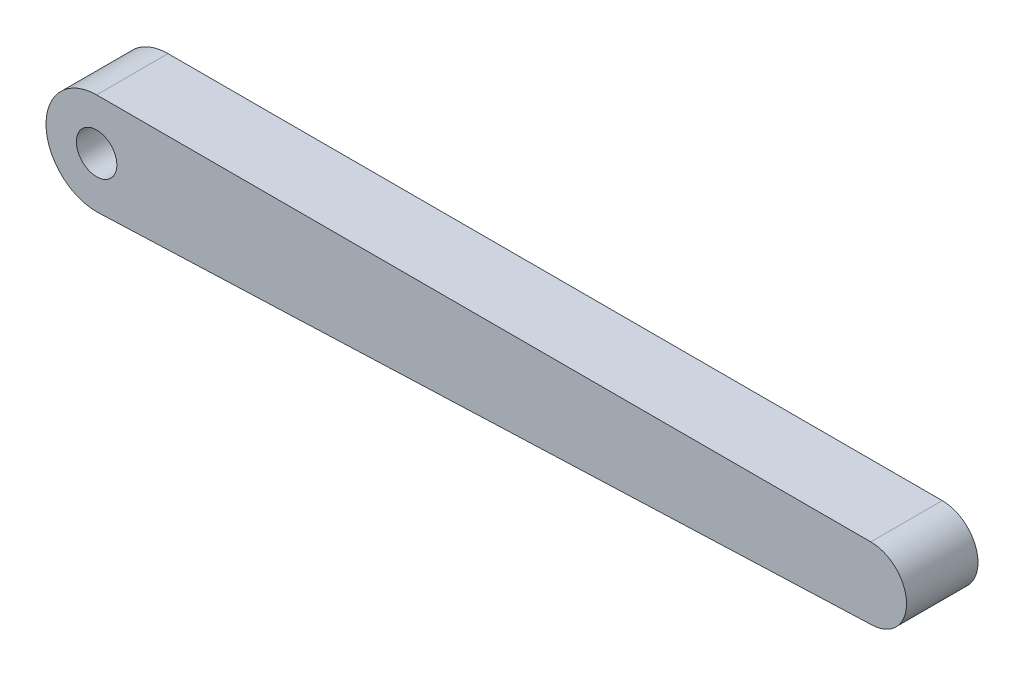
ISO-10303-21;
HEADER;
FILE_DESCRIPTION(('STEP AP214'),'2;1');
FILE_NAME('part.step','',(''),(''),'','','');
FILE_SCHEMA(('AUTOMOTIVE_DESIGN { 1 0 10303 214 1 1 1 1 }'));
ENDSEC;
DATA;
#1=APPLICATION_CONTEXT('core data for automotive mechanical design processes');
#2=APPLICATION_PROTOCOL_DEFINITION('international standard','automotive_design',2000,#1);
#3=PRODUCT_CONTEXT('',#1,'mechanical');
#4=PRODUCT('Part','Part','',(#3));
#5=PRODUCT_RELATED_PRODUCT_CATEGORY('part','',(#4));
#6=PRODUCT_DEFINITION_FORMATION('','',#4);
#7=PRODUCT_DEFINITION_CONTEXT('part definition',#1,'design');
#8=PRODUCT_DEFINITION('design','',#6,#7);
#9=PRODUCT_DEFINITION_SHAPE('','',#8);
#10=(LENGTH_UNIT() NAMED_UNIT(*) SI_UNIT(.MILLI.,.METRE.));
#11=(NAMED_UNIT(*) PLANE_ANGLE_UNIT() SI_UNIT($,.RADIAN.));
#12=(NAMED_UNIT(*) SI_UNIT($,.STERADIAN.) SOLID_ANGLE_UNIT());
#13=UNCERTAINTY_MEASURE_WITH_UNIT(LENGTH_MEASURE(1.E-05),#10,'distance_accuracy_value','');
#14=(GEOMETRIC_REPRESENTATION_CONTEXT(3) GLOBAL_UNCERTAINTY_ASSIGNED_CONTEXT((#13)) GLOBAL_UNIT_ASSIGNED_CONTEXT((#10,
#11,#12)) REPRESENTATION_CONTEXT('',''));
#15=CARTESIAN_POINT('',(0.,0.,0.));
#16=DIRECTION('',(0.,0.,1.));
#17=DIRECTION('',(1.,0.,0.));
#18=AXIS2_PLACEMENT_3D('',#15,#16,#17);
#19=CARTESIAN_POINT('',(0.,-4.25,6.));
#20=DIRECTION('',(0.,0.,-1.));
#21=DIRECTION('',(-1.,0.,0.));
#22=AXIS2_PLACEMENT_3D('',#19,#20,#21);
#23=CYLINDRICAL_SURFACE('',#22,4.25);
#24=CARTESIAN_POINT('',(0.,-4.25,0.));
#25=DIRECTION('',(0.,0.,1.));
#26=DIRECTION('',(1.,0.,0.));
#27=AXIS2_PLACEMENT_3D('',#24,#25,#26);
#28=CIRCLE('',#27,4.25);
#29=CARTESIAN_POINT('',(0.,0.,0.));
#30=VERTEX_POINT('',#29);
#31=CARTESIAN_POINT('',(0.,-8.5,0.));
#32=VERTEX_POINT('',#31);
#33=EDGE_CURVE('E113',#30,#32,#28,.T.);
#34=ORIENTED_EDGE('',*,*,#33,.T.);
#35=DIRECTION('',(0.,0.,-1.));
#36=VECTOR('',#35,1.);
#37=CARTESIAN_POINT('',(0.,-8.5,6.));
#38=LINE('',#37,#36);
#39=CARTESIAN_POINT('',(0.,-8.5,6.));
#40=VERTEX_POINT('',#39);
#41=EDGE_CURVE('E11',#40,#32,#38,.T.);
#42=ORIENTED_EDGE('',*,*,#41,.F.);
#43=CARTESIAN_POINT('',(0.,-4.25,6.));
#44=DIRECTION('',(0.,0.,1.));
#45=DIRECTION('',(1.,0.,0.));
#46=AXIS2_PLACEMENT_3D('',#43,#44,#45);
#47=CIRCLE('',#46,4.25);
#48=CARTESIAN_POINT('',(0.,0.,6.));
#49=VERTEX_POINT('',#48);
#50=EDGE_CURVE('E97',#49,#40,#47,.T.);
#51=ORIENTED_EDGE('',*,*,#50,.F.);
#52=DIRECTION('',(0.,0.,-1.));
#53=VECTOR('',#52,1.);
#54=CARTESIAN_POINT('',(0.,0.,6.));
#55=LINE('',#54,#53);
#56=EDGE_CURVE('E109',#49,#30,#55,.T.);
#57=ORIENTED_EDGE('',*,*,#56,.T.);
#58=EDGE_LOOP('',(#34,#42,#51,#57));
#59=FACE_BOUND('',#58,.T.);
#60=ADVANCED_FACE('F45',(#59),#23,.T.);
#61=CARTESIAN_POINT('',(65.,-6.,6.));
#62=DIRECTION('',(-0.0384331221012044,0.999261174631314,0.));
#63=DIRECTION('',(-0.999261174631314,-0.0384331221012044,0.));
#64=AXIS2_PLACEMENT_3D('',#61,#62,#63);
#65=PLANE('',#64);
#66=DIRECTION('',(0.999261174631314,0.0384331221012044,0.));
#67=VECTOR('',#66,1.);
#68=CARTESIAN_POINT('',(65.,-6.,0.));
#69=LINE('',#68,#67);
#70=CARTESIAN_POINT('',(65.,-6.,0.));
#71=VERTEX_POINT('',#70);
#72=EDGE_CURVE('E102',#32,#71,#69,.T.);
#73=ORIENTED_EDGE('',*,*,#72,.T.);
#74=DIRECTION('',(0.,0.,-1.));
#75=VECTOR('',#74,1.);
#76=CARTESIAN_POINT('',(65.,-6.,6.));
#77=LINE('',#76,#75);
#78=CARTESIAN_POINT('',(65.,-6.,6.));
#79=VERTEX_POINT('',#78);
#80=EDGE_CURVE('E54',#79,#71,#77,.T.);
#81=ORIENTED_EDGE('',*,*,#80,.F.);
#82=DIRECTION('',(0.999261174631314,0.0384331221012044,0.));
#83=VECTOR('',#82,1.);
#84=CARTESIAN_POINT('',(65.,-6.,6.));
#85=LINE('',#84,#83);
#86=EDGE_CURVE('E92',#40,#79,#85,.T.);
#87=ORIENTED_EDGE('',*,*,#86,.F.);
#88=ORIENTED_EDGE('',*,*,#41,.T.);
#89=EDGE_LOOP('',(#73,#81,#87,#88));
#90=FACE_BOUND('',#89,.T.);
#91=ADVANCED_FACE('F101',(#90),#65,.F.);
#92=CARTESIAN_POINT('',(65.,-3.,6.));
#93=DIRECTION('',(0.,0.,-1.));
#94=DIRECTION('',(-1.,0.,0.));
#95=AXIS2_PLACEMENT_3D('',#92,#93,#94);
#96=CYLINDRICAL_SURFACE('',#95,3.);
#97=CARTESIAN_POINT('',(65.,-3.,0.));
#98=DIRECTION('',(0.,0.,1.));
#99=DIRECTION('',(-1.,0.,0.));
#100=AXIS2_PLACEMENT_3D('',#97,#98,#99);
#101=CIRCLE('',#100,3.);
#102=CARTESIAN_POINT('',(65.,0.,0.));
#103=VERTEX_POINT('',#102);
#104=EDGE_CURVE('E79',#71,#103,#101,.T.);
#105=ORIENTED_EDGE('',*,*,#104,.T.);
#106=DIRECTION('',(0.,0.,-1.));
#107=VECTOR('',#106,1.);
#108=CARTESIAN_POINT('',(65.,0.,6.));
#109=LINE('',#108,#107);
#110=CARTESIAN_POINT('',(65.,0.,6.));
#111=VERTEX_POINT('',#110);
#112=EDGE_CURVE('E104',#111,#103,#109,.T.);
#113=ORIENTED_EDGE('',*,*,#112,.F.);
#114=CARTESIAN_POINT('',(65.,-3.,6.));
#115=DIRECTION('',(0.,0.,1.));
#116=DIRECTION('',(-1.,0.,0.));
#117=AXIS2_PLACEMENT_3D('',#114,#115,#116);
#118=CIRCLE('',#117,3.);
#119=EDGE_CURVE('E95',#79,#111,#118,.T.);
#120=ORIENTED_EDGE('',*,*,#119,.F.);
#121=ORIENTED_EDGE('',*,*,#80,.T.);
#122=EDGE_LOOP('',(#105,#113,#120,#121));
#123=FACE_BOUND('',#122,.T.);
#124=ADVANCED_FACE('F105',(#123),#96,.T.);
#125=CARTESIAN_POINT('',(0.,0.,6.));
#126=DIRECTION('',(0.,-1.,0.));
#127=DIRECTION('',(0.,0.,-1.));
#128=AXIS2_PLACEMENT_3D('',#125,#126,#127);
#129=PLANE('',#128);
#130=DIRECTION('',(-1.,0.,0.));
#131=VECTOR('',#130,1.);
#132=CARTESIAN_POINT('',(0.,0.,0.));
#133=LINE('',#132,#131);
#134=EDGE_CURVE('E85',#103,#30,#133,.T.);
#135=ORIENTED_EDGE('',*,*,#134,.T.);
#136=ORIENTED_EDGE('',*,*,#56,.F.);
#137=DIRECTION('',(-1.,0.,0.));
#138=VECTOR('',#137,1.);
#139=CARTESIAN_POINT('',(0.,0.,6.));
#140=LINE('',#139,#138);
#141=EDGE_CURVE('E62',#111,#49,#140,.T.);
#142=ORIENTED_EDGE('',*,*,#141,.F.);
#143=ORIENTED_EDGE('',*,*,#112,.T.);
#144=EDGE_LOOP('',(#135,#136,#142,#143));
#145=FACE_BOUND('',#144,.T.);
#146=ADVANCED_FACE('F127',(#145),#129,.F.);
#147=CARTESIAN_POINT('',(0.,-4.25,6.));
#148=DIRECTION('',(0.,0.,1.));
#149=DIRECTION('',(1.,0.,0.));
#150=AXIS2_PLACEMENT_3D('',#147,#148,#149);
#151=PLANE('',#150);
#152=CARTESIAN_POINT('',(0.,-4.25,6.));
#153=DIRECTION('',(0.,0.,1.));
#154=DIRECTION('',(1.,0.,0.));
#155=AXIS2_PLACEMENT_3D('',#152,#153,#154);
#156=CIRCLE('',#155,1.7);
#157=CARTESIAN_POINT('',(1.7,-4.25,6.));
#158=VERTEX_POINT('',#157);
#159=EDGE_CURVE('E134',#158,#158,#156,.T.);
#160=ORIENTED_EDGE('',*,*,#159,.F.);
#161=EDGE_LOOP('',(#160));
#162=FACE_BOUND('',#161,.T.);
#163=ORIENTED_EDGE('',*,*,#50,.T.);
#164=ORIENTED_EDGE('',*,*,#86,.T.);
#165=ORIENTED_EDGE('',*,*,#119,.T.);
#166=ORIENTED_EDGE('',*,*,#141,.T.);
#167=EDGE_LOOP('',(#163,#164,#165,#166));
#168=FACE_BOUND('',#167,.T.);
#169=ADVANCED_FACE('F93',(#162,#168),#151,.T.);
#170=CARTESIAN_POINT('',(0.,-4.25,0.));
#171=DIRECTION('',(0.,0.,1.));
#172=DIRECTION('',(1.,0.,0.));
#173=AXIS2_PLACEMENT_3D('',#170,#171,#172);
#174=PLANE('',#173);
#175=ORIENTED_EDGE('',*,*,#33,.F.);
#176=ORIENTED_EDGE('',*,*,#134,.F.);
#177=ORIENTED_EDGE('',*,*,#104,.F.);
#178=ORIENTED_EDGE('',*,*,#72,.F.);
#179=EDGE_LOOP('',(#175,#176,#177,#178));
#180=FACE_BOUND('',#179,.T.);
#181=ADVANCED_FACE('F130',(#180),#174,.F.);
#182=CARTESIAN_POINT('',(0.,-4.25,2.5));
#183=DIRECTION('',(0.,0.,1.));
#184=DIRECTION('',(1.,0.,0.));
#185=AXIS2_PLACEMENT_3D('',#182,#183,#184);
#186=CYLINDRICAL_SURFACE('',#185,1.7);
#187=CARTESIAN_POINT('',(0.,-4.25,2.5));
#188=DIRECTION('',(0.,0.,1.));
#189=DIRECTION('',(1.,0.,0.));
#190=AXIS2_PLACEMENT_3D('',#187,#188,#189);
#191=CIRCLE('',#190,1.7);
#192=CARTESIAN_POINT('',(1.7,-4.25,2.5));
#193=VERTEX_POINT('',#192);
#194=EDGE_CURVE('E117',#193,#193,#191,.T.);
#195=ORIENTED_EDGE('',*,*,#194,.F.);
#196=EDGE_LOOP('',(#195));
#197=FACE_BOUND('',#196,.T.);
#198=ORIENTED_EDGE('',*,*,#159,.T.);
#199=EDGE_LOOP('',(#198));
#200=FACE_BOUND('',#199,.T.);
#201=ADVANCED_FACE('F144',(#197,#200),#186,.F.);
#202=CARTESIAN_POINT('',(0.,-4.25,2.5));
#203=DIRECTION('',(0.,0.,1.));
#204=DIRECTION('',(1.,0.,0.));
#205=AXIS2_PLACEMENT_3D('',#202,#203,#204);
#206=PLANE('',#205);
#207=ORIENTED_EDGE('',*,*,#194,.T.);
#208=EDGE_LOOP('',(#207));
#209=FACE_BOUND('',#208,.T.);
#210=ADVANCED_FACE('F142',(#209),#206,.T.);
#211=CLOSED_SHELL('',(#60,#91,#124,#146,#169,#181,#201,#210));
#212=MANIFOLD_SOLID_BREP('B2',#211);
#213=ADVANCED_BREP_SHAPE_REPRESENTATION('',(#18,#212),#14);
#214=SHAPE_DEFINITION_REPRESENTATION(#9,#213);
ENDSEC;
END-ISO-10303-21;
